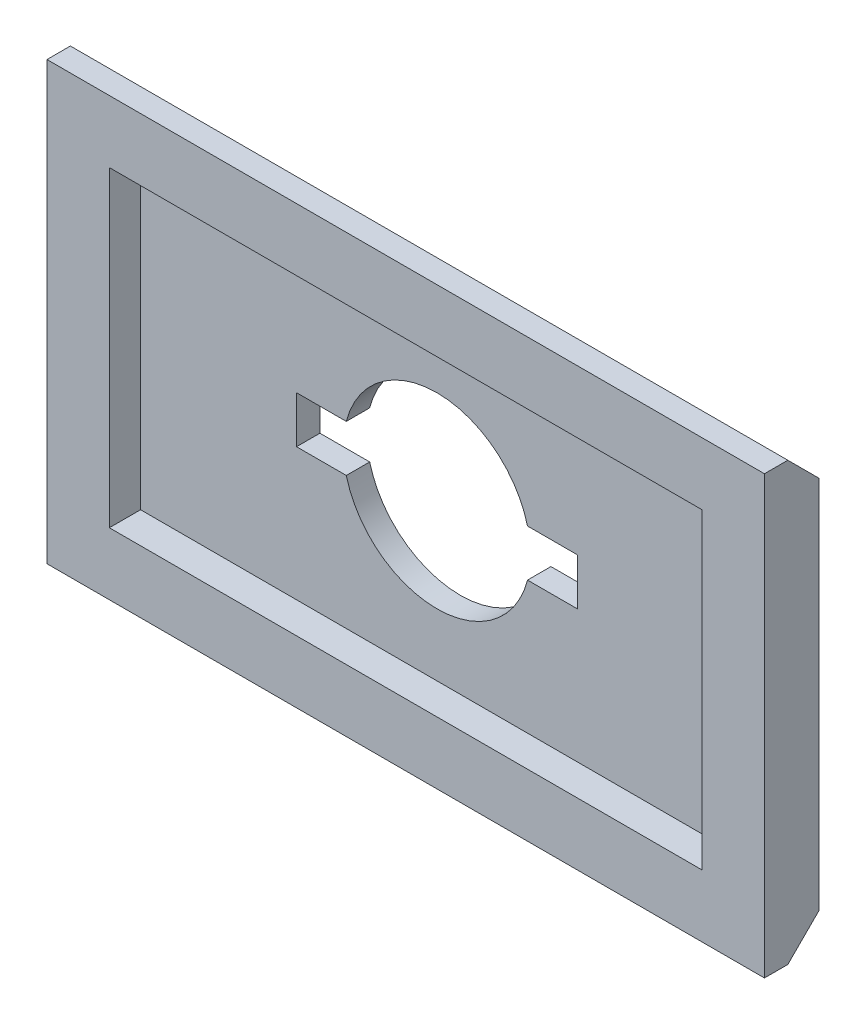
ISO-10303-21;
HEADER;
FILE_DESCRIPTION(('STEP AP214'),'2;1');
FILE_NAME('part.step','',(''),(''),'','','');
FILE_SCHEMA(('AUTOMOTIVE_DESIGN { 1 0 10303 214 1 1 1 1 }'));
ENDSEC;
DATA;
#1=APPLICATION_CONTEXT('core data for automotive mechanical design processes');
#2=APPLICATION_PROTOCOL_DEFINITION('international standard','automotive_design',2000,#1);
#3=PRODUCT_CONTEXT('',#1,'mechanical');
#4=PRODUCT('Part','Part','',(#3));
#5=PRODUCT_RELATED_PRODUCT_CATEGORY('part','',(#4));
#6=PRODUCT_DEFINITION_FORMATION('','',#4);
#7=PRODUCT_DEFINITION_CONTEXT('part definition',#1,'design');
#8=PRODUCT_DEFINITION('design','',#6,#7);
#9=PRODUCT_DEFINITION_SHAPE('','',#8);
#10=(LENGTH_UNIT() NAMED_UNIT(*) SI_UNIT(.MILLI.,.METRE.));
#11=(NAMED_UNIT(*) PLANE_ANGLE_UNIT() SI_UNIT($,.RADIAN.));
#12=(NAMED_UNIT(*) SI_UNIT($,.STERADIAN.) SOLID_ANGLE_UNIT());
#13=UNCERTAINTY_MEASURE_WITH_UNIT(LENGTH_MEASURE(1.E-05),#10,'distance_accuracy_value','');
#14=(GEOMETRIC_REPRESENTATION_CONTEXT(3) GLOBAL_UNCERTAINTY_ASSIGNED_CONTEXT((#13)) GLOBAL_UNIT_ASSIGNED_CONTEXT((#10,
#11,#12)) REPRESENTATION_CONTEXT('',''));
#15=CARTESIAN_POINT('',(0.,0.,0.));
#16=DIRECTION('',(0.,0.,1.));
#17=DIRECTION('',(1.,0.,0.));
#18=AXIS2_PLACEMENT_3D('',#15,#16,#17);
#19=CARTESIAN_POINT('',(0.,0.,3.5));
#20=DIRECTION('',(0.,0.,-1.));
#21=DIRECTION('',(-1.,0.,0.));
#22=AXIS2_PLACEMENT_3D('',#19,#20,#21);
#23=CYLINDRICAL_SURFACE('',#22,6.);
#24=DIRECTION('',(0.,0.,-1.));
#25=VECTOR('',#24,1.);
#26=CARTESIAN_POINT('',(-5.80947501931113,-1.5,3.5));
#27=LINE('',#26,#25);
#28=CARTESIAN_POINT('',(-5.80947501931113,-1.5,1.5));
#29=VERTEX_POINT('',#28);
#30=CARTESIAN_POINT('',(-5.80947501931113,-1.5,0.));
#31=VERTEX_POINT('',#30);
#32=EDGE_CURVE('E252',#29,#31,#27,.T.);
#33=ORIENTED_EDGE('',*,*,#32,.F.);
#34=CARTESIAN_POINT('',(0.,0.,1.5));
#35=DIRECTION('',(0.,0.,1.));
#36=DIRECTION('',(1.,0.,0.));
#37=AXIS2_PLACEMENT_3D('',#34,#35,#36);
#38=CIRCLE('',#37,6.);
#39=CARTESIAN_POINT('',(5.80947501931113,-1.5,1.5));
#40=VERTEX_POINT('',#39);
#41=EDGE_CURVE('E225',#29,#40,#38,.T.);
#42=ORIENTED_EDGE('',*,*,#41,.T.);
#43=DIRECTION('',(0.,0.,-1.));
#44=VECTOR('',#43,1.);
#45=CARTESIAN_POINT('',(5.80947501931113,-1.5,3.5));
#46=LINE('',#45,#44);
#47=CARTESIAN_POINT('',(5.80947501931113,-1.5,0.));
#48=VERTEX_POINT('',#47);
#49=EDGE_CURVE('E266',#40,#48,#46,.T.);
#50=ORIENTED_EDGE('',*,*,#49,.T.);
#51=CARTESIAN_POINT('',(0.,0.,0.));
#52=DIRECTION('',(0.,0.,1.));
#53=DIRECTION('',(1.,0.,0.));
#54=AXIS2_PLACEMENT_3D('',#51,#52,#53);
#55=CIRCLE('',#54,6.);
#56=EDGE_CURVE('E228',#31,#48,#55,.T.);
#57=ORIENTED_EDGE('',*,*,#56,.F.);
#58=EDGE_LOOP('',(#33,#42,#50,#57));
#59=FACE_BOUND('',#58,.T.);
#60=ADVANCED_FACE('F37',(#59),#23,.F.);
#61=CARTESIAN_POINT('',(5.80947501931113,-1.5,3.5));
#62=DIRECTION('',(0.,1.,0.));
#63=DIRECTION('',(0.,0.,1.));
#64=AXIS2_PLACEMENT_3D('',#61,#62,#63);
#65=PLANE('',#64);
#66=ORIENTED_EDGE('',*,*,#49,.F.);
#67=DIRECTION('',(1.,0.,0.));
#68=VECTOR('',#67,1.);
#69=CARTESIAN_POINT('',(5.80947501931113,-1.5,1.5));
#70=LINE('',#69,#68);
#71=CARTESIAN_POINT('',(9.,-1.5,1.5));
#72=VERTEX_POINT('',#71);
#73=EDGE_CURVE('E222',#40,#72,#70,.T.);
#74=ORIENTED_EDGE('',*,*,#73,.T.);
#75=DIRECTION('',(0.,0.,-1.));
#76=VECTOR('',#75,1.);
#77=CARTESIAN_POINT('',(9.,-1.5,3.5));
#78=LINE('',#77,#76);
#79=CARTESIAN_POINT('',(9.,-1.5,0.));
#80=VERTEX_POINT('',#79);
#81=EDGE_CURVE('E264',#72,#80,#78,.T.);
#82=ORIENTED_EDGE('',*,*,#81,.T.);
#83=DIRECTION('',(1.,0.,0.));
#84=VECTOR('',#83,1.);
#85=CARTESIAN_POINT('',(5.80947501931113,-1.5,0.));
#86=LINE('',#85,#84);
#87=EDGE_CURVE('E231',#48,#80,#86,.T.);
#88=ORIENTED_EDGE('',*,*,#87,.F.);
#89=EDGE_LOOP('',(#66,#74,#82,#88));
#90=FACE_BOUND('',#89,.T.);
#91=ADVANCED_FACE('F346',(#90),#65,.T.);
#92=CARTESIAN_POINT('',(9.,-1.5,3.5));
#93=DIRECTION('',(-1.,0.,0.));
#94=DIRECTION('',(0.,0.,1.));
#95=AXIS2_PLACEMENT_3D('',#92,#93,#94);
#96=PLANE('',#95);
#97=ORIENTED_EDGE('',*,*,#81,.F.);
#98=DIRECTION('',(0.,1.,0.));
#99=VECTOR('',#98,1.);
#100=CARTESIAN_POINT('',(9.,-1.5,1.5));
#101=LINE('',#100,#99);
#102=CARTESIAN_POINT('',(9.,1.5,1.5));
#103=VERTEX_POINT('',#102);
#104=EDGE_CURVE('E219',#72,#103,#101,.T.);
#105=ORIENTED_EDGE('',*,*,#104,.T.);
#106=DIRECTION('',(0.,0.,-1.));
#107=VECTOR('',#106,1.);
#108=CARTESIAN_POINT('',(9.,1.5,3.5));
#109=LINE('',#108,#107);
#110=CARTESIAN_POINT('',(9.,1.5,0.));
#111=VERTEX_POINT('',#110);
#112=EDGE_CURVE('E262',#103,#111,#109,.T.);
#113=ORIENTED_EDGE('',*,*,#112,.T.);
#114=DIRECTION('',(0.,1.,0.));
#115=VECTOR('',#114,1.);
#116=CARTESIAN_POINT('',(9.,-1.5,0.));
#117=LINE('',#116,#115);
#118=EDGE_CURVE('E234',#80,#111,#117,.T.);
#119=ORIENTED_EDGE('',*,*,#118,.F.);
#120=EDGE_LOOP('',(#97,#105,#113,#119));
#121=FACE_BOUND('',#120,.T.);
#122=ADVANCED_FACE('F351',(#121),#96,.T.);
#123=CARTESIAN_POINT('',(5.80947501931113,1.5,3.5));
#124=DIRECTION('',(0.,-1.,0.));
#125=DIRECTION('',(1.,0.,0.));
#126=AXIS2_PLACEMENT_3D('',#123,#124,#125);
#127=PLANE('',#126);
#128=ORIENTED_EDGE('',*,*,#112,.F.);
#129=DIRECTION('',(-1.,0.,0.));
#130=VECTOR('',#129,1.);
#131=CARTESIAN_POINT('',(5.80947501931113,1.5,1.5));
#132=LINE('',#131,#130);
#133=CARTESIAN_POINT('',(5.80947501931113,1.5,1.5));
#134=VERTEX_POINT('',#133);
#135=EDGE_CURVE('E216',#103,#134,#132,.T.);
#136=ORIENTED_EDGE('',*,*,#135,.T.);
#137=DIRECTION('',(0.,0.,-1.));
#138=VECTOR('',#137,1.);
#139=CARTESIAN_POINT('',(5.80947501931113,1.5,3.5));
#140=LINE('',#139,#138);
#141=CARTESIAN_POINT('',(5.80947501931113,1.5,0.));
#142=VERTEX_POINT('',#141);
#143=EDGE_CURVE('E260',#134,#142,#140,.T.);
#144=ORIENTED_EDGE('',*,*,#143,.T.);
#145=DIRECTION('',(-1.,0.,0.));
#146=VECTOR('',#145,1.);
#147=CARTESIAN_POINT('',(5.80947501931113,1.5,0.));
#148=LINE('',#147,#146);
#149=EDGE_CURVE('E237',#111,#142,#148,.T.);
#150=ORIENTED_EDGE('',*,*,#149,.F.);
#151=EDGE_LOOP('',(#128,#136,#144,#150));
#152=FACE_BOUND('',#151,.T.);
#153=ADVANCED_FACE('F358',(#152),#127,.T.);
#154=CARTESIAN_POINT('',(0.,0.,3.5));
#155=DIRECTION('',(0.,0.,-1.));
#156=DIRECTION('',(-1.,0.,0.));
#157=AXIS2_PLACEMENT_3D('',#154,#155,#156);
#158=CYLINDRICAL_SURFACE('',#157,6.);
#159=ORIENTED_EDGE('',*,*,#143,.F.);
#160=CARTESIAN_POINT('',(0.,0.,1.5));
#161=DIRECTION('',(0.,0.,1.));
#162=DIRECTION('',(1.,0.,0.));
#163=AXIS2_PLACEMENT_3D('',#160,#161,#162);
#164=CIRCLE('',#163,6.);
#165=CARTESIAN_POINT('',(-5.80947501931113,1.5,1.5));
#166=VERTEX_POINT('',#165);
#167=EDGE_CURVE('E213',#134,#166,#164,.T.);
#168=ORIENTED_EDGE('',*,*,#167,.T.);
#169=DIRECTION('',(0.,0.,-1.));
#170=VECTOR('',#169,1.);
#171=CARTESIAN_POINT('',(-5.80947501931113,1.5,3.5));
#172=LINE('',#171,#170);
#173=CARTESIAN_POINT('',(-5.80947501931113,1.5,0.));
#174=VERTEX_POINT('',#173);
#175=EDGE_CURVE('E258',#166,#174,#172,.T.);
#176=ORIENTED_EDGE('',*,*,#175,.T.);
#177=CARTESIAN_POINT('',(0.,0.,0.));
#178=DIRECTION('',(0.,0.,1.));
#179=DIRECTION('',(1.,0.,0.));
#180=AXIS2_PLACEMENT_3D('',#177,#178,#179);
#181=CIRCLE('',#180,6.);
#182=EDGE_CURVE('E240',#142,#174,#181,.T.);
#183=ORIENTED_EDGE('',*,*,#182,.F.);
#184=EDGE_LOOP('',(#159,#168,#176,#183));
#185=FACE_BOUND('',#184,.T.);
#186=ADVANCED_FACE('F362',(#185),#158,.F.);
#187=CARTESIAN_POINT('',(-9.,1.5,3.5));
#188=DIRECTION('',(0.,-1.,0.));
#189=DIRECTION('',(0.,0.,-1.));
#190=AXIS2_PLACEMENT_3D('',#187,#188,#189);
#191=PLANE('',#190);
#192=ORIENTED_EDGE('',*,*,#175,.F.);
#193=DIRECTION('',(-1.,0.,0.));
#194=VECTOR('',#193,1.);
#195=CARTESIAN_POINT('',(-9.,1.5,1.5));
#196=LINE('',#195,#194);
#197=CARTESIAN_POINT('',(-9.,1.5,1.5));
#198=VERTEX_POINT('',#197);
#199=EDGE_CURVE('E210',#166,#198,#196,.T.);
#200=ORIENTED_EDGE('',*,*,#199,.T.);
#201=DIRECTION('',(0.,0.,-1.));
#202=VECTOR('',#201,1.);
#203=CARTESIAN_POINT('',(-9.,1.5,3.5));
#204=LINE('',#203,#202);
#205=CARTESIAN_POINT('',(-9.,1.5,0.));
#206=VERTEX_POINT('',#205);
#207=EDGE_CURVE('E256',#198,#206,#204,.T.);
#208=ORIENTED_EDGE('',*,*,#207,.T.);
#209=DIRECTION('',(-1.,0.,0.));
#210=VECTOR('',#209,1.);
#211=CARTESIAN_POINT('',(-9.,1.5,0.));
#212=LINE('',#211,#210);
#213=EDGE_CURVE('E243',#174,#206,#212,.T.);
#214=ORIENTED_EDGE('',*,*,#213,.F.);
#215=EDGE_LOOP('',(#192,#200,#208,#214));
#216=FACE_BOUND('',#215,.T.);
#217=ADVANCED_FACE('F366',(#216),#191,.T.);
#218=CARTESIAN_POINT('',(-9.,-1.5,3.5));
#219=DIRECTION('',(1.,0.,0.));
#220=DIRECTION('',(0.,0.,-1.));
#221=AXIS2_PLACEMENT_3D('',#218,#219,#220);
#222=PLANE('',#221);
#223=ORIENTED_EDGE('',*,*,#207,.F.);
#224=DIRECTION('',(0.,-1.,0.));
#225=VECTOR('',#224,1.);
#226=CARTESIAN_POINT('',(-9.,-1.5,1.5));
#227=LINE('',#226,#225);
#228=CARTESIAN_POINT('',(-9.,-1.5,1.5));
#229=VERTEX_POINT('',#228);
#230=EDGE_CURVE('E204',#198,#229,#227,.T.);
#231=ORIENTED_EDGE('',*,*,#230,.T.);
#232=DIRECTION('',(0.,0.,-1.));
#233=VECTOR('',#232,1.);
#234=CARTESIAN_POINT('',(-9.,-1.5,3.5));
#235=LINE('',#234,#233);
#236=CARTESIAN_POINT('',(-9.,-1.5,0.));
#237=VERTEX_POINT('',#236);
#238=EDGE_CURVE('E254',#229,#237,#235,.T.);
#239=ORIENTED_EDGE('',*,*,#238,.T.);
#240=DIRECTION('',(0.,-1.,0.));
#241=VECTOR('',#240,1.);
#242=CARTESIAN_POINT('',(-9.,-1.5,0.));
#243=LINE('',#242,#241);
#244=EDGE_CURVE('E246',#206,#237,#243,.T.);
#245=ORIENTED_EDGE('',*,*,#244,.F.);
#246=EDGE_LOOP('',(#223,#231,#239,#245));
#247=FACE_BOUND('',#246,.T.);
#248=ADVANCED_FACE('F341',(#247),#222,.T.);
#249=CARTESIAN_POINT('',(-9.,-1.5,3.5));
#250=DIRECTION('',(0.,1.,0.));
#251=DIRECTION('',(0.,0.,1.));
#252=AXIS2_PLACEMENT_3D('',#249,#250,#251);
#253=PLANE('',#252);
#254=ORIENTED_EDGE('',*,*,#238,.F.);
#255=DIRECTION('',(1.,0.,0.));
#256=VECTOR('',#255,1.);
#257=CARTESIAN_POINT('',(-9.,-1.5,1.5));
#258=LINE('',#257,#256);
#259=EDGE_CURVE('E294',#229,#29,#258,.T.);
#260=ORIENTED_EDGE('',*,*,#259,.T.);
#261=ORIENTED_EDGE('',*,*,#32,.T.);
#262=DIRECTION('',(1.,0.,0.));
#263=VECTOR('',#262,1.);
#264=CARTESIAN_POINT('',(-9.,-1.5,0.));
#265=LINE('',#264,#263);
#266=EDGE_CURVE('E249',#237,#31,#265,.T.);
#267=ORIENTED_EDGE('',*,*,#266,.F.);
#268=EDGE_LOOP('',(#254,#260,#261,#267));
#269=FACE_BOUND('',#268,.T.);
#270=ADVANCED_FACE('F332',(#269),#253,.T.);
#271=CARTESIAN_POINT('',(0.,0.,3.5));
#272=DIRECTION('',(0.,0.,-1.));
#273=DIRECTION('',(-1.,0.,0.));
#274=AXIS2_PLACEMENT_3D('',#271,#272,#273);
#275=PLANE('',#274);
#276=DIRECTION('',(0.,1.,0.));
#277=VECTOR('',#276,1.);
#278=CARTESIAN_POINT('',(19.,-10.,3.5));
#279=LINE('',#278,#277);
#280=CARTESIAN_POINT('',(19.,-10.,3.5));
#281=VERTEX_POINT('',#280);
#282=CARTESIAN_POINT('',(19.,10.,3.5));
#283=VERTEX_POINT('',#282);
#284=EDGE_CURVE('E198',#281,#283,#279,.T.);
#285=ORIENTED_EDGE('',*,*,#284,.F.);
#286=DIRECTION('',(1.,0.,0.));
#287=VECTOR('',#286,1.);
#288=CARTESIAN_POINT('',(-19.,-10.,3.5));
#289=LINE('',#288,#287);
#290=CARTESIAN_POINT('',(-19.,-10.,3.5));
#291=VERTEX_POINT('',#290);
#292=EDGE_CURVE('E172',#291,#281,#289,.T.);
#293=ORIENTED_EDGE('',*,*,#292,.F.);
#294=DIRECTION('',(0.,-1.,0.));
#295=VECTOR('',#294,1.);
#296=CARTESIAN_POINT('',(-19.,10.,3.5));
#297=LINE('',#296,#295);
#298=CARTESIAN_POINT('',(-19.,10.,3.5));
#299=VERTEX_POINT('',#298);
#300=EDGE_CURVE('E189',#299,#291,#297,.T.);
#301=ORIENTED_EDGE('',*,*,#300,.F.);
#302=DIRECTION('',(-1.,0.,0.));
#303=VECTOR('',#302,1.);
#304=CARTESIAN_POINT('',(19.,10.,3.5));
#305=LINE('',#304,#303);
#306=EDGE_CURVE('E192',#283,#299,#305,.T.);
#307=ORIENTED_EDGE('',*,*,#306,.F.);
#308=EDGE_LOOP('',(#285,#293,#301,#307));
#309=FACE_BOUND('',#308,.T.);
#310=DIRECTION('',(0.,1.,0.));
#311=VECTOR('',#310,1.);
#312=CARTESIAN_POINT('',(23.,-14.,3.5));
#313=LINE('',#312,#311);
#314=CARTESIAN_POINT('',(23.,-14.,3.5));
#315=VERTEX_POINT('',#314);
#316=CARTESIAN_POINT('',(23.,14.,3.5));
#317=VERTEX_POINT('',#316);
#318=EDGE_CURVE('E269',#315,#317,#313,.T.);
#319=ORIENTED_EDGE('',*,*,#318,.T.);
#320=DIRECTION('',(-1.,0.,0.));
#321=VECTOR('',#320,1.);
#322=CARTESIAN_POINT('',(-23.,14.,3.5));
#323=LINE('',#322,#321);
#324=CARTESIAN_POINT('',(-23.,14.,3.5));
#325=VERTEX_POINT('',#324);
#326=EDGE_CURVE('E272',#317,#325,#323,.T.);
#327=ORIENTED_EDGE('',*,*,#326,.T.);
#328=DIRECTION('',(0.,-1.,0.));
#329=VECTOR('',#328,1.);
#330=CARTESIAN_POINT('',(-23.,-14.,3.5));
#331=LINE('',#330,#329);
#332=CARTESIAN_POINT('',(-23.,-14.,3.5));
#333=VERTEX_POINT('',#332);
#334=EDGE_CURVE('E275',#325,#333,#331,.T.);
#335=ORIENTED_EDGE('',*,*,#334,.T.);
#336=DIRECTION('',(1.,0.,0.));
#337=VECTOR('',#336,1.);
#338=CARTESIAN_POINT('',(-23.,-14.,3.5));
#339=LINE('',#338,#337);
#340=EDGE_CURVE('E277',#333,#315,#339,.T.);
#341=ORIENTED_EDGE('',*,*,#340,.T.);
#342=EDGE_LOOP('',(#319,#327,#335,#341));
#343=FACE_BOUND('',#342,.T.);
#344=ADVANCED_FACE('F330',(#309,#343),#275,.F.);
#345=CARTESIAN_POINT('',(0.,0.,0.));
#346=DIRECTION('',(0.,0.,-1.));
#347=DIRECTION('',(-1.,0.,0.));
#348=AXIS2_PLACEMENT_3D('',#345,#346,#347);
#349=PLANE('',#348);
#350=DIRECTION('',(0.,-1.,0.));
#351=VECTOR('',#350,1.);
#352=CARTESIAN_POINT('',(-23.,-14.,0.));
#353=LINE('',#352,#351);
#354=CARTESIAN_POINT('',(-23.,12.,0.));
#355=VERTEX_POINT('',#354);
#356=CARTESIAN_POINT('',(-23.,-12.,0.));
#357=VERTEX_POINT('',#356);
#358=EDGE_CURVE('E273',#355,#357,#353,.T.);
#359=ORIENTED_EDGE('',*,*,#358,.F.);
#360=DIRECTION('',(1.,0.,0.));
#361=VECTOR('',#360,1.);
#362=CARTESIAN_POINT('',(23.,12.,0.));
#363=LINE('',#362,#361);
#364=CARTESIAN_POINT('',(23.,12.,0.));
#365=VERTEX_POINT('',#364);
#366=EDGE_CURVE('E60',#355,#365,#363,.T.);
#367=ORIENTED_EDGE('',*,*,#366,.T.);
#368=DIRECTION('',(0.,1.,0.));
#369=VECTOR('',#368,1.);
#370=CARTESIAN_POINT('',(23.,-14.,0.));
#371=LINE('',#370,#369);
#372=CARTESIAN_POINT('',(23.,-12.,0.));
#373=VERTEX_POINT('',#372);
#374=EDGE_CURVE('E268',#373,#365,#371,.T.);
#375=ORIENTED_EDGE('',*,*,#374,.F.);
#376=DIRECTION('',(-1.,0.,0.));
#377=VECTOR('',#376,1.);
#378=CARTESIAN_POINT('',(-23.,-12.,0.));
#379=LINE('',#378,#377);
#380=EDGE_CURVE('E304',#373,#357,#379,.T.);
#381=ORIENTED_EDGE('',*,*,#380,.T.);
#382=EDGE_LOOP('',(#359,#367,#375,#381));
#383=FACE_BOUND('',#382,.T.);
#384=ORIENTED_EDGE('',*,*,#266,.T.);
#385=ORIENTED_EDGE('',*,*,#56,.T.);
#386=ORIENTED_EDGE('',*,*,#87,.T.);
#387=ORIENTED_EDGE('',*,*,#118,.T.);
#388=ORIENTED_EDGE('',*,*,#149,.T.);
#389=ORIENTED_EDGE('',*,*,#182,.T.);
#390=ORIENTED_EDGE('',*,*,#213,.T.);
#391=ORIENTED_EDGE('',*,*,#244,.T.);
#392=EDGE_LOOP('',(#384,#385,#386,#387,#388,#389,#390,#391));
#393=FACE_BOUND('',#392,.T.);
#394=ADVANCED_FACE('F322',(#383,#393),#349,.T.);
#395=CARTESIAN_POINT('',(23.,-14.,3.5));
#396=DIRECTION('',(-1.,0.,0.));
#397=DIRECTION('',(0.,0.,1.));
#398=AXIS2_PLACEMENT_3D('',#395,#396,#397);
#399=PLANE('',#398);
#400=ORIENTED_EDGE('',*,*,#374,.T.);
#401=DIRECTION('',(0.,0.707106781186549,0.707106781186546));
#402=VECTOR('',#401,1.);
#403=CARTESIAN_POINT('',(23.,14.,1.99999999999999));
#404=LINE('',#403,#402);
#405=CARTESIAN_POINT('',(23.,14.,1.99999999999999));
#406=VERTEX_POINT('',#405);
#407=EDGE_CURVE('E46',#365,#406,#404,.T.);
#408=ORIENTED_EDGE('',*,*,#407,.T.);
#409=DIRECTION('',(0.,0.,-1.));
#410=VECTOR('',#409,1.);
#411=CARTESIAN_POINT('',(23.,14.,3.5));
#412=LINE('',#411,#410);
#413=EDGE_CURVE('E291',#317,#406,#412,.T.);
#414=ORIENTED_EDGE('',*,*,#413,.F.);
#415=ORIENTED_EDGE('',*,*,#318,.F.);
#416=DIRECTION('',(0.,0.,-1.));
#417=VECTOR('',#416,1.);
#418=CARTESIAN_POINT('',(23.,-14.,3.5));
#419=LINE('',#418,#417);
#420=CARTESIAN_POINT('',(23.,-14.,2.));
#421=VERTEX_POINT('',#420);
#422=EDGE_CURVE('E279',#315,#421,#419,.T.);
#423=ORIENTED_EDGE('',*,*,#422,.T.);
#424=DIRECTION('',(0.,0.707106781186549,-0.707106781186546));
#425=VECTOR('',#424,1.);
#426=CARTESIAN_POINT('',(23.,-14.,2.));
#427=LINE('',#426,#425);
#428=EDGE_CURVE('E53',#421,#373,#427,.T.);
#429=ORIENTED_EDGE('',*,*,#428,.T.);
#430=EDGE_LOOP('',(#400,#408,#414,#415,#423,#429));
#431=FACE_BOUND('',#430,.T.);
#432=ADVANCED_FACE('F310',(#431),#399,.F.);
#433=CARTESIAN_POINT('',(-23.,14.,3.5));
#434=DIRECTION('',(0.,-1.,0.));
#435=DIRECTION('',(0.,0.,-1.));
#436=AXIS2_PLACEMENT_3D('',#433,#434,#435);
#437=PLANE('',#436);
#438=ORIENTED_EDGE('',*,*,#413,.T.);
#439=DIRECTION('',(-1.,0.,0.));
#440=VECTOR('',#439,1.);
#441=CARTESIAN_POINT('',(-23.,14.,1.99999999999999));
#442=LINE('',#441,#440);
#443=CARTESIAN_POINT('',(-23.,14.,1.99999999999999));
#444=VERTEX_POINT('',#443);
#445=EDGE_CURVE('E297',#406,#444,#442,.T.);
#446=ORIENTED_EDGE('',*,*,#445,.T.);
#447=DIRECTION('',(0.,0.,-1.));
#448=VECTOR('',#447,1.);
#449=CARTESIAN_POINT('',(-23.,14.,3.5));
#450=LINE('',#449,#448);
#451=EDGE_CURVE('E288',#325,#444,#450,.T.);
#452=ORIENTED_EDGE('',*,*,#451,.F.);
#453=ORIENTED_EDGE('',*,*,#326,.F.);
#454=EDGE_LOOP('',(#438,#446,#452,#453));
#455=FACE_BOUND('',#454,.T.);
#456=ADVANCED_FACE('F315',(#455),#437,.F.);
#457=CARTESIAN_POINT('',(-23.,-14.,3.5));
#458=DIRECTION('',(1.,0.,0.));
#459=DIRECTION('',(0.,0.,-1.));
#460=AXIS2_PLACEMENT_3D('',#457,#458,#459);
#461=PLANE('',#460);
#462=ORIENTED_EDGE('',*,*,#451,.T.);
#463=DIRECTION('',(0.,-0.707106781186549,-0.707106781186546));
#464=VECTOR('',#463,1.);
#465=CARTESIAN_POINT('',(-23.,14.,1.99999999999999));
#466=LINE('',#465,#464);
#467=EDGE_CURVE('E302',#444,#355,#466,.T.);
#468=ORIENTED_EDGE('',*,*,#467,.T.);
#469=ORIENTED_EDGE('',*,*,#358,.T.);
#470=DIRECTION('',(0.,-0.707106781186549,0.707106781186546));
#471=VECTOR('',#470,1.);
#472=CARTESIAN_POINT('',(-23.,-14.,2.));
#473=LINE('',#472,#471);
#474=CARTESIAN_POINT('',(-23.,-14.,2.));
#475=VERTEX_POINT('',#474);
#476=EDGE_CURVE('E300',#357,#475,#473,.T.);
#477=ORIENTED_EDGE('',*,*,#476,.T.);
#478=DIRECTION('',(0.,0.,-1.));
#479=VECTOR('',#478,1.);
#480=CARTESIAN_POINT('',(-23.,-14.,3.5));
#481=LINE('',#480,#479);
#482=EDGE_CURVE('E285',#333,#475,#481,.T.);
#483=ORIENTED_EDGE('',*,*,#482,.F.);
#484=ORIENTED_EDGE('',*,*,#334,.F.);
#485=EDGE_LOOP('',(#462,#468,#469,#477,#483,#484));
#486=FACE_BOUND('',#485,.T.);
#487=ADVANCED_FACE('F319',(#486),#461,.F.);
#488=CARTESIAN_POINT('',(-23.,-14.,3.5));
#489=DIRECTION('',(0.,1.,0.));
#490=DIRECTION('',(0.,0.,1.));
#491=AXIS2_PLACEMENT_3D('',#488,#489,#490);
#492=PLANE('',#491);
#493=ORIENTED_EDGE('',*,*,#482,.T.);
#494=DIRECTION('',(1.,0.,0.));
#495=VECTOR('',#494,1.);
#496=CARTESIAN_POINT('',(23.,-14.,2.));
#497=LINE('',#496,#495);
#498=EDGE_CURVE('E11',#475,#421,#497,.T.);
#499=ORIENTED_EDGE('',*,*,#498,.T.);
#500=ORIENTED_EDGE('',*,*,#422,.F.);
#501=ORIENTED_EDGE('',*,*,#340,.F.);
#502=EDGE_LOOP('',(#493,#499,#500,#501));
#503=FACE_BOUND('',#502,.T.);
#504=ADVANCED_FACE('F327',(#503),#492,.F.);
#505=CARTESIAN_POINT('',(-19.,-10.,1.5));
#506=DIRECTION('',(0.,-1.,0.));
#507=DIRECTION('',(0.,0.,-1.));
#508=AXIS2_PLACEMENT_3D('',#505,#506,#507);
#509=PLANE('',#508);
#510=ORIENTED_EDGE('',*,*,#292,.T.);
#511=DIRECTION('',(0.,0.,1.));
#512=VECTOR('',#511,1.);
#513=CARTESIAN_POINT('',(19.,-10.,1.5));
#514=LINE('',#513,#512);
#515=CARTESIAN_POINT('',(19.,-10.,1.5));
#516=VERTEX_POINT('',#515);
#517=EDGE_CURVE('E165',#516,#281,#514,.T.);
#518=ORIENTED_EDGE('',*,*,#517,.F.);
#519=DIRECTION('',(1.,0.,0.));
#520=VECTOR('',#519,1.);
#521=CARTESIAN_POINT('',(-19.,-10.,1.5));
#522=LINE('',#521,#520);
#523=CARTESIAN_POINT('',(-19.,-10.,1.5));
#524=VERTEX_POINT('',#523);
#525=EDGE_CURVE('E169',#524,#516,#522,.T.);
#526=ORIENTED_EDGE('',*,*,#525,.F.);
#527=DIRECTION('',(0.,0.,1.));
#528=VECTOR('',#527,1.);
#529=CARTESIAN_POINT('',(-19.,-10.,1.5));
#530=LINE('',#529,#528);
#531=EDGE_CURVE('E202',#524,#291,#530,.T.);
#532=ORIENTED_EDGE('',*,*,#531,.T.);
#533=EDGE_LOOP('',(#510,#518,#526,#532));
#534=FACE_BOUND('',#533,.T.);
#535=ADVANCED_FACE('F167',(#534),#509,.F.);
#536=CARTESIAN_POINT('',(-19.,10.,1.5));
#537=DIRECTION('',(-1.,0.,0.));
#538=DIRECTION('',(0.,0.,1.));
#539=AXIS2_PLACEMENT_3D('',#536,#537,#538);
#540=PLANE('',#539);
#541=ORIENTED_EDGE('',*,*,#300,.T.);
#542=ORIENTED_EDGE('',*,*,#531,.F.);
#543=DIRECTION('',(0.,-1.,0.));
#544=VECTOR('',#543,1.);
#545=CARTESIAN_POINT('',(-19.,10.,1.5));
#546=LINE('',#545,#544);
#547=CARTESIAN_POINT('',(-19.,10.,1.5));
#548=VERTEX_POINT('',#547);
#549=EDGE_CURVE('E177',#548,#524,#546,.T.);
#550=ORIENTED_EDGE('',*,*,#549,.F.);
#551=DIRECTION('',(0.,0.,1.));
#552=VECTOR('',#551,1.);
#553=CARTESIAN_POINT('',(-19.,10.,1.5));
#554=LINE('',#553,#552);
#555=EDGE_CURVE('E205',#548,#299,#554,.T.);
#556=ORIENTED_EDGE('',*,*,#555,.T.);
#557=EDGE_LOOP('',(#541,#542,#550,#556));
#558=FACE_BOUND('',#557,.T.);
#559=ADVANCED_FACE('F376',(#558),#540,.F.);
#560=CARTESIAN_POINT('',(19.,10.,1.5));
#561=DIRECTION('',(0.,1.,0.));
#562=DIRECTION('',(0.,0.,1.));
#563=AXIS2_PLACEMENT_3D('',#560,#561,#562);
#564=PLANE('',#563);
#565=ORIENTED_EDGE('',*,*,#306,.T.);
#566=ORIENTED_EDGE('',*,*,#555,.F.);
#567=DIRECTION('',(-1.,0.,0.));
#568=VECTOR('',#567,1.);
#569=CARTESIAN_POINT('',(19.,10.,1.5));
#570=LINE('',#569,#568);
#571=CARTESIAN_POINT('',(19.,10.,1.5));
#572=VERTEX_POINT('',#571);
#573=EDGE_CURVE('E185',#572,#548,#570,.T.);
#574=ORIENTED_EDGE('',*,*,#573,.F.);
#575=DIRECTION('',(0.,0.,1.));
#576=VECTOR('',#575,1.);
#577=CARTESIAN_POINT('',(19.,10.,1.5));
#578=LINE('',#577,#576);
#579=EDGE_CURVE('E176',#572,#283,#578,.T.);
#580=ORIENTED_EDGE('',*,*,#579,.T.);
#581=EDGE_LOOP('',(#565,#566,#574,#580));
#582=FACE_BOUND('',#581,.T.);
#583=ADVANCED_FACE('F379',(#582),#564,.F.);
#584=CARTESIAN_POINT('',(19.,-10.,1.5));
#585=DIRECTION('',(1.,0.,0.));
#586=DIRECTION('',(0.,0.,-1.));
#587=AXIS2_PLACEMENT_3D('',#584,#585,#586);
#588=PLANE('',#587);
#589=ORIENTED_EDGE('',*,*,#284,.T.);
#590=ORIENTED_EDGE('',*,*,#579,.F.);
#591=DIRECTION('',(0.,1.,0.));
#592=VECTOR('',#591,1.);
#593=CARTESIAN_POINT('',(19.,-10.,1.5));
#594=LINE('',#593,#592);
#595=EDGE_CURVE('E180',#516,#572,#594,.T.);
#596=ORIENTED_EDGE('',*,*,#595,.F.);
#597=ORIENTED_EDGE('',*,*,#517,.T.);
#598=EDGE_LOOP('',(#589,#590,#596,#597));
#599=FACE_BOUND('',#598,.T.);
#600=ADVANCED_FACE('F181',(#599),#588,.F.);
#601=CARTESIAN_POINT('',(0.,0.,1.5));
#602=DIRECTION('',(0.,0.,1.));
#603=DIRECTION('',(1.,0.,0.));
#604=AXIS2_PLACEMENT_3D('',#601,#602,#603);
#605=PLANE('',#604);
#606=ORIENTED_EDGE('',*,*,#259,.F.);
#607=ORIENTED_EDGE('',*,*,#230,.F.);
#608=ORIENTED_EDGE('',*,*,#199,.F.);
#609=ORIENTED_EDGE('',*,*,#167,.F.);
#610=ORIENTED_EDGE('',*,*,#135,.F.);
#611=ORIENTED_EDGE('',*,*,#104,.F.);
#612=ORIENTED_EDGE('',*,*,#73,.F.);
#613=ORIENTED_EDGE('',*,*,#41,.F.);
#614=EDGE_LOOP('',(#606,#607,#608,#609,#610,#611,#612,#613));
#615=FACE_BOUND('',#614,.T.);
#616=ORIENTED_EDGE('',*,*,#525,.T.);
#617=ORIENTED_EDGE('',*,*,#595,.T.);
#618=ORIENTED_EDGE('',*,*,#573,.T.);
#619=ORIENTED_EDGE('',*,*,#549,.T.);
#620=EDGE_LOOP('',(#616,#617,#618,#619));
#621=FACE_BOUND('',#620,.T.);
#622=ADVANCED_FACE('F187',(#615,#621),#605,.T.);
#623=CARTESIAN_POINT('',(-23.,14.,1.99999999999999));
#624=DIRECTION('',(0.,0.707106781186546,-0.707106781186549));
#625=DIRECTION('',(1.,0.,0.));
#626=AXIS2_PLACEMENT_3D('',#623,#624,#625);
#627=PLANE('',#626);
#628=ORIENTED_EDGE('',*,*,#407,.F.);
#629=ORIENTED_EDGE('',*,*,#366,.F.);
#630=ORIENTED_EDGE('',*,*,#467,.F.);
#631=ORIENTED_EDGE('',*,*,#445,.F.);
#632=EDGE_LOOP('',(#628,#629,#630,#631));
#633=FACE_BOUND('',#632,.T.);
#634=ADVANCED_FACE('F317',(#633),#627,.T.);
#635=CARTESIAN_POINT('',(-23.,-14.,2.));
#636=DIRECTION('',(0.,-0.707106781186546,-0.707106781186549));
#637=DIRECTION('',(-1.,0.,0.));
#638=AXIS2_PLACEMENT_3D('',#635,#636,#637);
#639=PLANE('',#638);
#640=ORIENTED_EDGE('',*,*,#476,.F.);
#641=ORIENTED_EDGE('',*,*,#380,.F.);
#642=ORIENTED_EDGE('',*,*,#428,.F.);
#643=ORIENTED_EDGE('',*,*,#498,.F.);
#644=EDGE_LOOP('',(#640,#641,#642,#643));
#645=FACE_BOUND('',#644,.T.);
#646=ADVANCED_FACE('F40',(#645),#639,.T.);
#647=CLOSED_SHELL('',(#60,#91,#122,#153,#186,#217,#248,#270,#344,#394,#432,#456,#487,#504,#535,
#559,#583,#600,#622,#634,#646));
#648=MANIFOLD_SOLID_BREP('B2',#647);
#649=ADVANCED_BREP_SHAPE_REPRESENTATION('',(#18,#648),#14);
#650=SHAPE_DEFINITION_REPRESENTATION(#9,#649);
ENDSEC;
END-ISO-10303-21;
